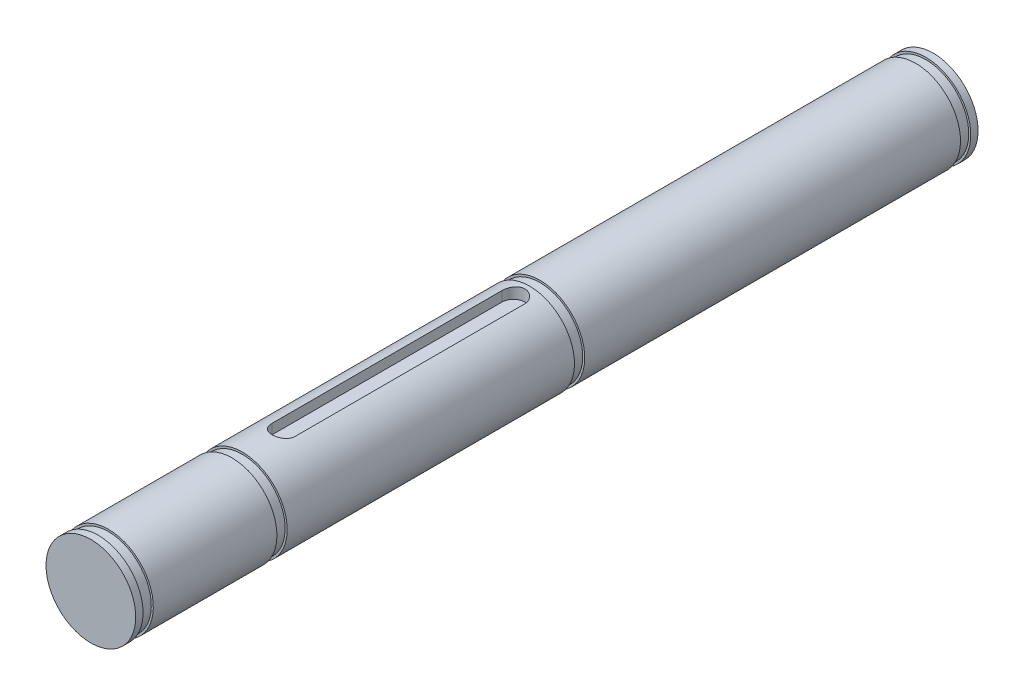
ISO-10303-21;
HEADER;
FILE_DESCRIPTION(('STEP AP214'),'2;1');
FILE_NAME('part.step','',(''),(''),'','','');
FILE_SCHEMA(('AUTOMOTIVE_DESIGN { 1 0 10303 214 1 1 1 1 }'));
ENDSEC;
DATA;
#1=APPLICATION_CONTEXT('core data for automotive mechanical design processes');
#2=APPLICATION_PROTOCOL_DEFINITION('international standard','automotive_design',2000,#1);
#3=PRODUCT_CONTEXT('',#1,'mechanical');
#4=PRODUCT('Part','Part','',(#3));
#5=PRODUCT_RELATED_PRODUCT_CATEGORY('part','',(#4));
#6=PRODUCT_DEFINITION_FORMATION('','',#4);
#7=PRODUCT_DEFINITION_CONTEXT('part definition',#1,'design');
#8=PRODUCT_DEFINITION('design','',#6,#7);
#9=PRODUCT_DEFINITION_SHAPE('','',#8);
#10=(LENGTH_UNIT() NAMED_UNIT(*) SI_UNIT(.MILLI.,.METRE.));
#11=(NAMED_UNIT(*) PLANE_ANGLE_UNIT() SI_UNIT($,.RADIAN.));
#12=(NAMED_UNIT(*) SI_UNIT($,.STERADIAN.) SOLID_ANGLE_UNIT());
#13=UNCERTAINTY_MEASURE_WITH_UNIT(LENGTH_MEASURE(1.E-05),#10,'distance_accuracy_value','');
#14=(GEOMETRIC_REPRESENTATION_CONTEXT(3) GLOBAL_UNCERTAINTY_ASSIGNED_CONTEXT((#13)) GLOBAL_UNIT_ASSIGNED_CONTEXT((#10,
#11,#12)) REPRESENTATION_CONTEXT('',''));
#15=CARTESIAN_POINT('',(0.,0.,0.));
#16=DIRECTION('',(0.,0.,1.));
#17=DIRECTION('',(1.,0.,0.));
#18=AXIS2_PLACEMENT_3D('',#15,#16,#17);
#19=CARTESIAN_POINT('',(0.,0.,0.));
#20=DIRECTION('',(0.,0.,-1.));
#21=DIRECTION('',(-1.,0.,0.));
#22=AXIS2_PLACEMENT_3D('',#19,#20,#21);
#23=CYLINDRICAL_SURFACE('',#22,6.223);
#24=CARTESIAN_POINT('',(0.,0.,0.));
#25=DIRECTION('',(0.,0.,-1.));
#26=DIRECTION('',(-1.,0.,0.));
#27=AXIS2_PLACEMENT_3D('',#24,#25,#26);
#28=CIRCLE('',#27,6.223);
#29=CARTESIAN_POINT('',(-6.223,0.,0.));
#30=VERTEX_POINT('',#29);
#31=EDGE_CURVE('E160',#30,#30,#28,.T.);
#32=ORIENTED_EDGE('',*,*,#31,.T.);
#33=EDGE_LOOP('',(#32));
#34=FACE_BOUND('',#33,.T.);
#35=CARTESIAN_POINT('',(0.,0.,-1.016));
#36=DIRECTION('',(0.,0.,-1.));
#37=DIRECTION('',(0.,1.,0.));
#38=AXIS2_PLACEMENT_3D('',#35,#36,#37);
#39=CIRCLE('',#38,6.223);
#40=CARTESIAN_POINT('',(0.,6.223,-1.016));
#41=VERTEX_POINT('',#40);
#42=EDGE_CURVE('E161',#41,#41,#39,.F.);
#43=ORIENTED_EDGE('',*,*,#42,.T.);
#44=EDGE_LOOP('',(#43));
#45=FACE_BOUND('',#44,.T.);
#46=ADVANCED_FACE('F43',(#34,#45),#23,.T.);
#47=CARTESIAN_POINT('',(0.,0.,0.));
#48=DIRECTION('',(0.,0.,1.));
#49=DIRECTION('',(1.,0.,0.));
#50=AXIS2_PLACEMENT_3D('',#47,#48,#49);
#51=PLANE('',#50);
#52=ORIENTED_EDGE('',*,*,#31,.F.);
#53=EDGE_LOOP('',(#52));
#54=FACE_BOUND('',#53,.T.);
#55=ADVANCED_FACE('F45',(#54),#51,.T.);
#56=CARTESIAN_POINT('',(0.,5.9436,-1.016));
#57=DIRECTION('',(0.,0.,-1.));
#58=DIRECTION('',(0.,1.,0.));
#59=AXIS2_PLACEMENT_3D('',#56,#57,#58);
#60=PLANE('',#59);
#61=ORIENTED_EDGE('',*,*,#42,.F.);
#62=EDGE_LOOP('',(#61));
#63=FACE_BOUND('',#62,.T.);
#64=CARTESIAN_POINT('',(0.,0.,-1.016));
#65=DIRECTION('',(0.,0.,-1.));
#66=DIRECTION('',(0.,1.,0.));
#67=AXIS2_PLACEMENT_3D('',#64,#65,#66);
#68=CIRCLE('',#67,5.9436);
#69=CARTESIAN_POINT('',(0.,5.9436,-1.016));
#70=VERTEX_POINT('',#69);
#71=EDGE_CURVE('E124',#70,#70,#68,.T.);
#72=ORIENTED_EDGE('',*,*,#71,.F.);
#73=EDGE_LOOP('',(#72));
#74=FACE_BOUND('',#73,.T.);
#75=ADVANCED_FACE('F269',(#63,#74),#60,.T.);
#76=CARTESIAN_POINT('',(0.,5.9436,-2.4384));
#77=DIRECTION('',(0.,0.,-1.));
#78=DIRECTION('',(0.,1.,0.));
#79=AXIS2_PLACEMENT_3D('',#76,#77,#78);
#80=PLANE('',#79);
#81=CARTESIAN_POINT('',(0.,0.,-2.4384));
#82=DIRECTION('',(0.,0.,-1.));
#83=DIRECTION('',(0.,1.,0.));
#84=AXIS2_PLACEMENT_3D('',#81,#82,#83);
#85=CIRCLE('',#84,6.223);
#86=CARTESIAN_POINT('',(0.,6.223,-2.4384));
#87=VERTEX_POINT('',#86);
#88=EDGE_CURVE('E189',#87,#87,#85,.F.);
#89=ORIENTED_EDGE('',*,*,#88,.T.);
#90=EDGE_LOOP('',(#89));
#91=FACE_BOUND('',#90,.T.);
#92=CARTESIAN_POINT('',(0.,0.,-2.4384));
#93=DIRECTION('',(0.,0.,-1.));
#94=DIRECTION('',(0.,1.,0.));
#95=AXIS2_PLACEMENT_3D('',#92,#93,#94);
#96=CIRCLE('',#95,5.9436);
#97=CARTESIAN_POINT('',(0.,5.9436,-2.4384));
#98=VERTEX_POINT('',#97);
#99=EDGE_CURVE('E128',#98,#98,#96,.T.);
#100=ORIENTED_EDGE('',*,*,#99,.T.);
#101=EDGE_LOOP('',(#100));
#102=FACE_BOUND('',#101,.T.);
#103=ADVANCED_FACE('F292',(#91,#102),#80,.F.);
#104=CARTESIAN_POINT('',(0.,0.,0.));
#105=DIRECTION('',(0.,0.,-1.));
#106=DIRECTION('',(0.,1.,0.));
#107=AXIS2_PLACEMENT_3D('',#104,#105,#106);
#108=CYLINDRICAL_SURFACE('',#107,5.9436);
#109=ORIENTED_EDGE('',*,*,#99,.F.);
#110=EDGE_LOOP('',(#109));
#111=FACE_BOUND('',#110,.T.);
#112=ORIENTED_EDGE('',*,*,#71,.T.);
#113=EDGE_LOOP('',(#112));
#114=FACE_BOUND('',#113,.T.);
#115=ADVANCED_FACE('F220',(#111,#114),#108,.T.);
#116=ORIENTED_EDGE('',*,*,#88,.F.);
#117=EDGE_LOOP('',(#116));
#118=FACE_BOUND('',#117,.T.);
#119=CARTESIAN_POINT('',(0.,0.,-19.5834));
#120=DIRECTION('',(0.,0.,-1.));
#121=DIRECTION('',(0.,1.,0.));
#122=AXIS2_PLACEMENT_3D('',#119,#120,#121);
#123=CIRCLE('',#122,6.223);
#124=CARTESIAN_POINT('',(0.,6.223,-19.5834));
#125=VERTEX_POINT('',#124);
#126=EDGE_CURVE('E169',#125,#125,#123,.F.);
#127=ORIENTED_EDGE('',*,*,#126,.T.);
#128=EDGE_LOOP('',(#127));
#129=FACE_BOUND('',#128,.T.);
#130=ADVANCED_FACE('F259',(#118,#129),#23,.T.);
#131=CARTESIAN_POINT('',(0.,5.9436,-19.5834));
#132=DIRECTION('',(0.,0.,-1.));
#133=DIRECTION('',(0.,1.,0.));
#134=AXIS2_PLACEMENT_3D('',#131,#132,#133);
#135=PLANE('',#134);
#136=ORIENTED_EDGE('',*,*,#126,.F.);
#137=EDGE_LOOP('',(#136));
#138=FACE_BOUND('',#137,.T.);
#139=CARTESIAN_POINT('',(0.,0.,-19.5834));
#140=DIRECTION('',(0.,0.,-1.));
#141=DIRECTION('',(0.,1.,0.));
#142=AXIS2_PLACEMENT_3D('',#139,#140,#141);
#143=CIRCLE('',#142,5.9436);
#144=CARTESIAN_POINT('',(0.,5.9436,-19.5834));
#145=VERTEX_POINT('',#144);
#146=EDGE_CURVE('E146',#145,#145,#143,.T.);
#147=ORIENTED_EDGE('',*,*,#146,.F.);
#148=EDGE_LOOP('',(#147));
#149=FACE_BOUND('',#148,.T.);
#150=ADVANCED_FACE('F283',(#138,#149),#135,.T.);
#151=CARTESIAN_POINT('',(0.,5.9436,-21.0058));
#152=DIRECTION('',(0.,0.,-1.));
#153=DIRECTION('',(0.,1.,0.));
#154=AXIS2_PLACEMENT_3D('',#151,#152,#153);
#155=PLANE('',#154);
#156=CARTESIAN_POINT('',(0.,0.,-21.0058));
#157=DIRECTION('',(0.,0.,-1.));
#158=DIRECTION('',(0.,1.,0.));
#159=AXIS2_PLACEMENT_3D('',#156,#157,#158);
#160=CIRCLE('',#159,6.223);
#161=CARTESIAN_POINT('',(0.,6.223,-21.0058));
#162=VERTEX_POINT('',#161);
#163=EDGE_CURVE('E133',#162,#162,#160,.F.);
#164=ORIENTED_EDGE('',*,*,#163,.T.);
#165=EDGE_LOOP('',(#164));
#166=FACE_BOUND('',#165,.T.);
#167=CARTESIAN_POINT('',(0.,0.,-21.0058));
#168=DIRECTION('',(0.,0.,-1.));
#169=DIRECTION('',(0.,1.,0.));
#170=AXIS2_PLACEMENT_3D('',#167,#168,#169);
#171=CIRCLE('',#170,5.9436);
#172=CARTESIAN_POINT('',(0.,5.9436,-21.0058));
#173=VERTEX_POINT('',#172);
#174=EDGE_CURVE('E117',#173,#173,#171,.T.);
#175=ORIENTED_EDGE('',*,*,#174,.T.);
#176=EDGE_LOOP('',(#175));
#177=FACE_BOUND('',#176,.T.);
#178=ADVANCED_FACE('F289',(#166,#177),#155,.F.);
#179=CARTESIAN_POINT('',(0.,0.,0.));
#180=DIRECTION('',(0.,0.,-1.));
#181=DIRECTION('',(0.,1.,0.));
#182=AXIS2_PLACEMENT_3D('',#179,#180,#181);
#183=CYLINDRICAL_SURFACE('',#182,5.9436);
#184=ORIENTED_EDGE('',*,*,#174,.F.);
#185=EDGE_LOOP('',(#184));
#186=FACE_BOUND('',#185,.T.);
#187=ORIENTED_EDGE('',*,*,#146,.T.);
#188=EDGE_LOOP('',(#187));
#189=FACE_BOUND('',#188,.T.);
#190=ADVANCED_FACE('F237',(#186,#189),#183,.T.);
#191=CARTESIAN_POINT('',(1.5875,6.01710667596977,-58.6105));
#192=CARTESIAN_POINT('',(1.5875005701701,6.01710364845781,-58.6543838559361));
#193=CARTESIAN_POINT('',(1.58567919296902,6.01758736569205,-58.698245934586));
#194=CARTESIAN_POINT('',(1.57841866111704,6.01949703107223,-58.7856414354814));
#195=CARTESIAN_POINT('',(1.57298013404162,6.02092281576919,-58.8291749134142));
#196=CARTESIAN_POINT('',(1.55131916197274,6.02655570446071,-58.9586260804381));
#197=CARTESIAN_POINT('',(1.52975096821002,6.03211870377822,-59.043653214695));
#198=CARTESIAN_POINT('',(1.47306141360106,6.04621039434029,-59.2087258604606));
#199=CARTESIAN_POINT('',(1.43794164745103,6.05473873662317,-59.2887719568319));
#200=CARTESIAN_POINT('',(1.35518953397575,6.07379514839304,-59.4418780696546));
#201=CARTESIAN_POINT('',(1.30755359796304,6.08432379117421,-59.5149360742435));
#202=CARTESIAN_POINT('',(1.19996859488497,6.10646163717685,-59.6536164108676));
#203=CARTESIAN_POINT('',(1.1397869868597,6.11808857604108,-59.7190554672265));
#204=CARTESIAN_POINT('',(1.00931412313929,6.14096034374597,-59.8390344795371));
#205=CARTESIAN_POINT('',(0.939021247363957,6.15220511099547,-59.8935726855448));
#206=CARTESIAN_POINT('',(0.789056046686835,6.17324278337169,-59.9909542008227));
#207=CARTESIAN_POINT('',(0.709262053994441,6.18301216443855,-60.0336156622201));
#208=CARTESIAN_POINT('',(0.543348080872327,6.19979381228296,-60.1048477653913));
#209=CARTESIAN_POINT('',(0.457229385336776,6.2068066372395,-60.133421260156));
#210=CARTESIAN_POINT('',(0.283030293016381,6.21715952316581,-60.1750767944438));
#211=CARTESIAN_POINT('',(0.195029302972404,6.22057376031613,-60.1884721492321));
#212=CARTESIAN_POINT('',(0.0179654008725225,6.22360356313391,-60.200375425507));
#213=CARTESIAN_POINT('',(-0.0710973698212901,6.22321962895926,-60.1988853071702));
#214=CARTESIAN_POINT('',(-0.245577328268625,6.218751155342,-60.1812832888146));
#215=CARTESIAN_POINT('',(-0.331031202569417,6.21475231769183,-60.1655099982174));
#216=CARTESIAN_POINT('',(-0.498035898847957,6.20360360177289,-60.1203346538793));
#217=CARTESIAN_POINT('',(-0.579586544001189,6.19645358089836,-60.0909319833423));
#218=CARTESIAN_POINT('',(-0.737355483050921,6.17967587694757,-60.0190625423046));
#219=CARTESIAN_POINT('',(-0.813516931427579,6.17002570112479,-59.9764764509113));
#220=CARTESIAN_POINT('',(-0.957728419355806,6.14929270179402,-59.8795406094037));
#221=CARTESIAN_POINT('',(-1.02577717459688,6.13820965202686,-59.8251890005295));
#222=CARTESIAN_POINT('',(-1.1538464146154,6.11544941756022,-59.7044625336326));
#223=CARTESIAN_POINT('',(-1.21358813277447,6.1037642876235,-59.6377931626802));
#224=CARTESIAN_POINT('',(-1.32112100786564,6.08139740926303,-59.4952409823488));
#225=CARTESIAN_POINT('',(-1.36890888586843,6.07071593664229,-59.4193556535002));
#226=CARTESIAN_POINT('',(-1.45136992703091,6.05153400133908,-59.259949090009));
#227=CARTESIAN_POINT('',(-1.4859659958378,6.04304645028231,-59.1763864060228));
#228=CARTESIAN_POINT('',(-1.54048655383295,6.02938085007214,-59.0044104649481));
#229=CARTESIAN_POINT('',(-1.56043300375462,6.02419784872824,-58.9160046826629));
#230=CARTESIAN_POINT('',(-1.57764773242627,6.019698856486,-58.790772657454));
#231=CARTESIAN_POINT('',(-1.58134288301185,6.01872834590968,-58.7547945790882));
#232=CARTESIAN_POINT('',(-1.58626628840802,6.01743251129064,-58.6827167376414));
#233=CARTESIAN_POINT('',(-1.58749850987853,6.01710614982697,-58.6466172641706));
#234=CARTESIAN_POINT('',(-1.5875,6.01710667596977,-58.6105));
#235=B_SPLINE_CURVE_WITH_KNOTS('',3,(#191,#192,#193,#194,#195,#196,#197,#198,#199,#200,#201,
#202,#203,#204,#205,#206,#207,#208,#209,#210,#211,#212,#213,#214,#215,#216,#217,#218,#219,#220,
#221,#222,#223,#224,#225,#226,#227,#228,#229,#230,#231,#232,#233,#234),.UNSPECIFIED.,.F.,.F.,(4,
2,2,2,2,2,2,2,2,2,2,2,2,2,2,2,2,2,2,2,2,4),(0.,0.131568299053689,0.26311377696094,
0.525438742200572,0.787732847470651,1.05010224100555,1.31785377248123,1.58564825239251,
1.85734198979802,2.12898068317312,2.39490364205535,2.66079158363921,2.92053658849681,
3.18029334923529,3.44247348094867,3.7046950631172,3.97427268453386,4.24392417000194,
4.51512821871098,4.78592488040758,4.89439368330592,5.00268765102122),.UNSPECIFIED.);
#236=CARTESIAN_POINT('',(1.5875,6.01710667596977,-58.6105));
#237=VERTEX_POINT('',#236);
#238=CARTESIAN_POINT('',(-1.5875,6.01710667596977,-58.6105));
#239=VERTEX_POINT('',#238);
#240=EDGE_CURVE('E165',#237,#239,#235,.T.);
#241=ORIENTED_EDGE('',*,*,#240,.F.);
#242=DIRECTION('',(0.,0.,-1.));
#243=VECTOR('',#242,1.);
#244=CARTESIAN_POINT('',(1.5875,6.01710667596977,0.));
#245=LINE('',#244,#243);
#246=CARTESIAN_POINT('',(1.5875,6.01710667596977,-26.7335));
#247=VERTEX_POINT('',#246);
#248=EDGE_CURVE('E11',#247,#237,#245,.T.);
#249=ORIENTED_EDGE('',*,*,#248,.F.);
#250=CARTESIAN_POINT('',(-1.5875,6.01710667596977,-26.7335));
#251=CARTESIAN_POINT('',(-1.5875005701701,6.01710364845781,-26.6896161440639));
#252=CARTESIAN_POINT('',(-1.58567919296902,6.01758736569206,-26.645754065414));
#253=CARTESIAN_POINT('',(-1.57841866111703,6.01949703107223,-26.5583585645186));
#254=CARTESIAN_POINT('',(-1.57298013404161,6.02092281576919,-26.5148250865857));
#255=CARTESIAN_POINT('',(-1.55131916197274,6.02655570446071,-26.3853739195619));
#256=CARTESIAN_POINT('',(-1.52975096821001,6.03211870377822,-26.300346785305));
#257=CARTESIAN_POINT('',(-1.47306141360106,6.04621039434029,-26.1352741395394));
#258=CARTESIAN_POINT('',(-1.43794164745103,6.05473873662317,-26.0552280431681));
#259=CARTESIAN_POINT('',(-1.35518953397575,6.07379514839304,-25.9021219303454));
#260=CARTESIAN_POINT('',(-1.30755359796304,6.08432379117421,-25.8290639257565));
#261=CARTESIAN_POINT('',(-1.19996859488497,6.10646163717685,-25.6903835891324));
#262=CARTESIAN_POINT('',(-1.1397869868597,6.11808857604108,-25.6249445327734));
#263=CARTESIAN_POINT('',(-1.00931412313929,6.14096034374597,-25.5049655204629));
#264=CARTESIAN_POINT('',(-0.939021247363956,6.15220511099547,-25.4504273144552));
#265=CARTESIAN_POINT('',(-0.789056046686833,6.17324278337169,-25.3530457991772));
#266=CARTESIAN_POINT('',(-0.709262053994439,6.18301216443855,-25.3103843377798));
#267=CARTESIAN_POINT('',(-0.543348080872324,6.19979381228296,-25.2391522346087));
#268=CARTESIAN_POINT('',(-0.457229385336775,6.2068066372395,-25.210578739844));
#269=CARTESIAN_POINT('',(-0.283030293016381,6.21715952316581,-25.1689232055562));
#270=CARTESIAN_POINT('',(-0.195029302972405,6.22057376031613,-25.1555278507679));
#271=CARTESIAN_POINT('',(-0.0179654008725233,6.22360356313391,-25.1436245744929));
#272=CARTESIAN_POINT('',(0.0710973698212896,6.22321962895926,-25.1451146928298));
#273=CARTESIAN_POINT('',(0.245577328268624,6.218751155342,-25.1627167111854));
#274=CARTESIAN_POINT('',(0.331031202569416,6.21475231769183,-25.1784900017826));
#275=CARTESIAN_POINT('',(0.498035898847957,6.20360360177289,-25.2236653461207));
#276=CARTESIAN_POINT('',(0.57958654400119,6.19645358089836,-25.2530680166577));
#277=CARTESIAN_POINT('',(0.737355483050923,6.17967587694757,-25.3249374576954));
#278=CARTESIAN_POINT('',(0.81351693142758,6.17002570112479,-25.3675235490887));
#279=CARTESIAN_POINT('',(0.957728419355807,6.14929270179402,-25.4644593905962));
#280=CARTESIAN_POINT('',(1.02577717459688,6.13820965202686,-25.5188109994705));
#281=CARTESIAN_POINT('',(1.1538464146154,6.11544941756022,-25.6395374663674));
#282=CARTESIAN_POINT('',(1.21358813277448,6.1037642876235,-25.7062068373198));
#283=CARTESIAN_POINT('',(1.32112100786564,6.08139740926303,-25.8487590176512));
#284=CARTESIAN_POINT('',(1.36890888586843,6.07071593664228,-25.9246443464997));
#285=CARTESIAN_POINT('',(1.45136992703091,6.05153400133908,-26.084050909991));
#286=CARTESIAN_POINT('',(1.4859659958378,6.04304645028231,-26.1676135939772));
#287=CARTESIAN_POINT('',(1.54048655383295,6.02938085007214,-26.3395895350518));
#288=CARTESIAN_POINT('',(1.56043300375462,6.02419784872824,-26.4279953173371));
#289=CARTESIAN_POINT('',(1.57764773242627,6.019698856486,-26.553227342546));
#290=CARTESIAN_POINT('',(1.58134288301185,6.01872834590968,-26.5892054209118));
#291=CARTESIAN_POINT('',(1.58626628840802,6.01743251129064,-26.6612832623586));
#292=CARTESIAN_POINT('',(1.58749850987853,6.01710614982697,-26.6973827358294));
#293=CARTESIAN_POINT('',(1.5875,6.01710667596977,-26.7335));
#294=B_SPLINE_CURVE_WITH_KNOTS('',3,(#250,#251,#252,#253,#254,#255,#256,#257,#258,#259,#260,
#261,#262,#263,#264,#265,#266,#267,#268,#269,#270,#271,#272,#273,#274,#275,#276,#277,#278,#279,
#280,#281,#282,#283,#284,#285,#286,#287,#288,#289,#290,#291,#292,#293),.UNSPECIFIED.,.F.,.F.,(4,
2,2,2,2,2,2,2,2,2,2,2,2,2,2,2,2,2,2,2,2,4),(0.,0.131568299053696,0.263113776960947,
0.525438742200575,0.787732847470659,1.05010224100556,1.31785377248123,1.58564825239251,
1.85734198979803,2.12898068317312,2.39490364205535,2.66079158363921,2.92053658849681,
3.18029334923529,3.44247348094867,3.70469506311721,3.97427268453387,4.24392417000194,
4.51512821871099,4.78592488040759,4.89439368330592,5.00268765102122),.UNSPECIFIED.);
#295=CARTESIAN_POINT('',(-1.5875,6.01710667596977,-26.7335));
#296=VERTEX_POINT('',#295);
#297=EDGE_CURVE('E52',#296,#247,#294,.T.);
#298=ORIENTED_EDGE('',*,*,#297,.F.);
#299=DIRECTION('',(0.,0.,-1.));
#300=VECTOR('',#299,1.);
#301=CARTESIAN_POINT('',(-1.5875,6.01710667596977,0.));
#302=LINE('',#301,#300);
#303=EDGE_CURVE('E203',#239,#296,#302,.F.);
#304=ORIENTED_EDGE('',*,*,#303,.F.);
#305=EDGE_LOOP('',(#241,#249,#298,#304));
#306=FACE_BOUND('',#305,.T.);
#307=ORIENTED_EDGE('',*,*,#163,.F.);
#308=EDGE_LOOP('',(#307));
#309=FACE_BOUND('',#308,.T.);
#310=CARTESIAN_POINT('',(0.,0.,-60.8584));
#311=DIRECTION('',(0.,0.,-1.));
#312=DIRECTION('',(0.,1.,0.));
#313=AXIS2_PLACEMENT_3D('',#310,#311,#312);
#314=CIRCLE('',#313,6.223);
#315=CARTESIAN_POINT('',(0.,6.223,-60.8584));
#316=VERTEX_POINT('',#315);
#317=EDGE_CURVE('E185',#316,#316,#314,.F.);
#318=ORIENTED_EDGE('',*,*,#317,.T.);
#319=EDGE_LOOP('',(#318));
#320=FACE_BOUND('',#319,.T.);
#321=ADVANCED_FACE('F233',(#306,#309,#320),#23,.T.);
#322=CARTESIAN_POINT('',(0.,5.9436,-60.8584));
#323=DIRECTION('',(0.,0.,-1.));
#324=DIRECTION('',(0.,1.,0.));
#325=AXIS2_PLACEMENT_3D('',#322,#323,#324);
#326=PLANE('',#325);
#327=ORIENTED_EDGE('',*,*,#317,.F.);
#328=EDGE_LOOP('',(#327));
#329=FACE_BOUND('',#328,.T.);
#330=CARTESIAN_POINT('',(0.,0.,-60.8584));
#331=DIRECTION('',(0.,0.,-1.));
#332=DIRECTION('',(0.,1.,0.));
#333=AXIS2_PLACEMENT_3D('',#330,#331,#332);
#334=CIRCLE('',#333,5.94359999999999);
#335=CARTESIAN_POINT('',(0.,5.9436,-60.8584));
#336=VERTEX_POINT('',#335);
#337=EDGE_CURVE('E129',#336,#336,#334,.T.);
#338=ORIENTED_EDGE('',*,*,#337,.F.);
#339=EDGE_LOOP('',(#338));
#340=FACE_BOUND('',#339,.T.);
#341=ADVANCED_FACE('F236',(#329,#340),#326,.T.);
#342=CARTESIAN_POINT('',(0.,5.9436,-62.2808));
#343=DIRECTION('',(0.,0.,-1.));
#344=DIRECTION('',(0.,1.,0.));
#345=AXIS2_PLACEMENT_3D('',#342,#343,#344);
#346=PLANE('',#345);
#347=CARTESIAN_POINT('',(0.,0.,-62.2808));
#348=DIRECTION('',(0.,0.,-1.));
#349=DIRECTION('',(0.,1.,0.));
#350=AXIS2_PLACEMENT_3D('',#347,#348,#349);
#351=CIRCLE('',#350,6.223);
#352=CARTESIAN_POINT('',(0.,6.223,-62.2808));
#353=VERTEX_POINT('',#352);
#354=EDGE_CURVE('E181',#353,#353,#351,.F.);
#355=ORIENTED_EDGE('',*,*,#354,.T.);
#356=EDGE_LOOP('',(#355));
#357=FACE_BOUND('',#356,.T.);
#358=CARTESIAN_POINT('',(0.,0.,-62.2808));
#359=DIRECTION('',(0.,0.,-1.));
#360=DIRECTION('',(0.,1.,0.));
#361=AXIS2_PLACEMENT_3D('',#358,#359,#360);
#362=CIRCLE('',#361,5.94359999999999);
#363=CARTESIAN_POINT('',(0.,5.9436,-62.2808));
#364=VERTEX_POINT('',#363);
#365=EDGE_CURVE('E134',#364,#364,#362,.T.);
#366=ORIENTED_EDGE('',*,*,#365,.T.);
#367=EDGE_LOOP('',(#366));
#368=FACE_BOUND('',#367,.T.);
#369=ADVANCED_FACE('F245',(#357,#368),#346,.F.);
#370=CARTESIAN_POINT('',(0.,0.,0.));
#371=DIRECTION('',(0.,0.,-1.));
#372=DIRECTION('',(0.,1.,0.));
#373=AXIS2_PLACEMENT_3D('',#370,#371,#372);
#374=CYLINDRICAL_SURFACE('',#373,5.94359999999999);
#375=ORIENTED_EDGE('',*,*,#365,.F.);
#376=EDGE_LOOP('',(#375));
#377=FACE_BOUND('',#376,.T.);
#378=ORIENTED_EDGE('',*,*,#337,.T.);
#379=EDGE_LOOP('',(#378));
#380=FACE_BOUND('',#379,.T.);
#381=ADVANCED_FACE('F249',(#377,#380),#374,.T.);
#382=ORIENTED_EDGE('',*,*,#354,.F.);
#383=EDGE_LOOP('',(#382));
#384=FACE_BOUND('',#383,.T.);
#385=CARTESIAN_POINT('',(0.,0.,-114.4016));
#386=DIRECTION('',(0.,0.,-1.));
#387=DIRECTION('',(0.,1.,0.));
#388=AXIS2_PLACEMENT_3D('',#385,#386,#387);
#389=CIRCLE('',#388,6.223);
#390=CARTESIAN_POINT('',(0.,6.223,-114.4016));
#391=VERTEX_POINT('',#390);
#392=EDGE_CURVE('E177',#391,#391,#389,.F.);
#393=ORIENTED_EDGE('',*,*,#392,.T.);
#394=EDGE_LOOP('',(#393));
#395=FACE_BOUND('',#394,.T.);
#396=ADVANCED_FACE('F238',(#384,#395),#23,.T.);
#397=CARTESIAN_POINT('',(0.,5.9436,-114.4016));
#398=DIRECTION('',(0.,0.,-1.));
#399=DIRECTION('',(0.,1.,0.));
#400=AXIS2_PLACEMENT_3D('',#397,#398,#399);
#401=PLANE('',#400);
#402=ORIENTED_EDGE('',*,*,#392,.F.);
#403=EDGE_LOOP('',(#402));
#404=FACE_BOUND('',#403,.T.);
#405=CARTESIAN_POINT('',(0.,0.,-114.4016));
#406=DIRECTION('',(0.,0.,-1.));
#407=DIRECTION('',(0.,1.,0.));
#408=AXIS2_PLACEMENT_3D('',#405,#406,#407);
#409=CIRCLE('',#408,5.94359999999999);
#410=CARTESIAN_POINT('',(0.,5.9436,-114.4016));
#411=VERTEX_POINT('',#410);
#412=EDGE_CURVE('E138',#411,#411,#409,.T.);
#413=ORIENTED_EDGE('',*,*,#412,.F.);
#414=EDGE_LOOP('',(#413));
#415=FACE_BOUND('',#414,.T.);
#416=ADVANCED_FACE('F257',(#404,#415),#401,.T.);
#417=CARTESIAN_POINT('',(0.,5.9436,-115.824));
#418=DIRECTION('',(0.,0.,-1.));
#419=DIRECTION('',(0.,1.,0.));
#420=AXIS2_PLACEMENT_3D('',#417,#418,#419);
#421=PLANE('',#420);
#422=CARTESIAN_POINT('',(0.,0.,-115.824));
#423=DIRECTION('',(0.,0.,-1.));
#424=DIRECTION('',(0.,1.,0.));
#425=AXIS2_PLACEMENT_3D('',#422,#423,#424);
#426=CIRCLE('',#425,6.223);
#427=CARTESIAN_POINT('',(0.,6.223,-115.824));
#428=VERTEX_POINT('',#427);
#429=EDGE_CURVE('E173',#428,#428,#426,.F.);
#430=ORIENTED_EDGE('',*,*,#429,.T.);
#431=EDGE_LOOP('',(#430));
#432=FACE_BOUND('',#431,.T.);
#433=CARTESIAN_POINT('',(0.,0.,-115.824));
#434=DIRECTION('',(0.,0.,-1.));
#435=DIRECTION('',(0.,1.,0.));
#436=AXIS2_PLACEMENT_3D('',#433,#434,#435);
#437=CIRCLE('',#436,5.94359999999999);
#438=CARTESIAN_POINT('',(0.,5.9436,-115.824));
#439=VERTEX_POINT('',#438);
#440=EDGE_CURVE('E142',#439,#439,#437,.T.);
#441=ORIENTED_EDGE('',*,*,#440,.T.);
#442=EDGE_LOOP('',(#441));
#443=FACE_BOUND('',#442,.T.);
#444=ADVANCED_FACE('F312',(#432,#443),#421,.F.);
#445=CARTESIAN_POINT('',(0.,0.,0.));
#446=DIRECTION('',(0.,0.,-1.));
#447=DIRECTION('',(0.,1.,0.));
#448=AXIS2_PLACEMENT_3D('',#445,#446,#447);
#449=CYLINDRICAL_SURFACE('',#448,5.94359999999999);
#450=ORIENTED_EDGE('',*,*,#440,.F.);
#451=EDGE_LOOP('',(#450));
#452=FACE_BOUND('',#451,.T.);
#453=ORIENTED_EDGE('',*,*,#412,.T.);
#454=EDGE_LOOP('',(#453));
#455=FACE_BOUND('',#454,.T.);
#456=ADVANCED_FACE('F278',(#452,#455),#449,.T.);
#457=CARTESIAN_POINT('',(0.,0.,-116.84));
#458=DIRECTION('',(0.,0.,-1.));
#459=DIRECTION('',(-1.,0.,0.));
#460=AXIS2_PLACEMENT_3D('',#457,#458,#459);
#461=PLANE('',#460);
#462=CARTESIAN_POINT('',(0.,0.,-116.84));
#463=DIRECTION('',(0.,0.,-1.));
#464=DIRECTION('',(-1.,0.,0.));
#465=AXIS2_PLACEMENT_3D('',#462,#463,#464);
#466=CIRCLE('',#465,6.223);
#467=CARTESIAN_POINT('',(-6.223,0.,-116.84));
#468=VERTEX_POINT('',#467);
#469=EDGE_CURVE('E156',#468,#468,#466,.T.);
#470=ORIENTED_EDGE('',*,*,#469,.T.);
#471=EDGE_LOOP('',(#470));
#472=FACE_BOUND('',#471,.T.);
#473=ADVANCED_FACE('F273',(#472),#461,.T.);
#474=ORIENTED_EDGE('',*,*,#429,.F.);
#475=EDGE_LOOP('',(#474));
#476=FACE_BOUND('',#475,.T.);
#477=ORIENTED_EDGE('',*,*,#469,.F.);
#478=EDGE_LOOP('',(#477));
#479=FACE_BOUND('',#478,.T.);
#480=ADVANCED_FACE('F204',(#476,#479),#23,.T.);
#481=CARTESIAN_POINT('',(0.,4.6355,-26.7335));
#482=DIRECTION('',(0.,1.,0.));
#483=DIRECTION('',(0.,0.,1.));
#484=AXIS2_PLACEMENT_3D('',#481,#482,#483);
#485=CYLINDRICAL_SURFACE('',#484,1.5875);
#486=DIRECTION('',(0.,1.,0.));
#487=VECTOR('',#486,1.);
#488=CARTESIAN_POINT('',(-1.5875,4.6355,-26.7335));
#489=LINE('',#488,#487);
#490=CARTESIAN_POINT('',(-1.5875,4.6355,-26.7335));
#491=VERTEX_POINT('',#490);
#492=EDGE_CURVE('E114',#491,#296,#489,.T.);
#493=ORIENTED_EDGE('',*,*,#492,.T.);
#494=ORIENTED_EDGE('',*,*,#297,.T.);
#495=DIRECTION('',(0.,1.,0.));
#496=VECTOR('',#495,1.);
#497=CARTESIAN_POINT('',(1.5875,4.6355,-26.7335));
#498=LINE('',#497,#496);
#499=CARTESIAN_POINT('',(1.5875,4.6355,-26.7335));
#500=VERTEX_POINT('',#499);
#501=EDGE_CURVE('E58',#500,#247,#498,.T.);
#502=ORIENTED_EDGE('',*,*,#501,.F.);
#503=CARTESIAN_POINT('',(0.,4.6355,-26.7335));
#504=DIRECTION('',(0.,1.,0.));
#505=DIRECTION('',(0.,0.,1.));
#506=AXIS2_PLACEMENT_3D('',#503,#504,#505);
#507=CIRCLE('',#506,1.5875);
#508=EDGE_CURVE('E87',#491,#500,#507,.T.);
#509=ORIENTED_EDGE('',*,*,#508,.F.);
#510=EDGE_LOOP('',(#493,#494,#502,#509));
#511=FACE_BOUND('',#510,.T.);
#512=ADVANCED_FACE('F85',(#511),#485,.F.);
#513=CARTESIAN_POINT('',(-1.5875,4.6355,-26.7335));
#514=DIRECTION('',(-1.,0.,0.));
#515=DIRECTION('',(0.,0.,1.));
#516=AXIS2_PLACEMENT_3D('',#513,#514,#515);
#517=PLANE('',#516);
#518=ORIENTED_EDGE('',*,*,#303,.T.);
#519=ORIENTED_EDGE('',*,*,#492,.F.);
#520=DIRECTION('',(0.,0.,1.));
#521=VECTOR('',#520,1.);
#522=CARTESIAN_POINT('',(-1.5875,4.6355,-26.7335));
#523=LINE('',#522,#521);
#524=CARTESIAN_POINT('',(-1.5875,4.6355,-58.6105));
#525=VERTEX_POINT('',#524);
#526=EDGE_CURVE('E91',#525,#491,#523,.T.);
#527=ORIENTED_EDGE('',*,*,#526,.F.);
#528=DIRECTION('',(0.,1.,0.));
#529=VECTOR('',#528,1.);
#530=CARTESIAN_POINT('',(-1.5875,4.6355,-58.6105));
#531=LINE('',#530,#529);
#532=EDGE_CURVE('E118',#525,#239,#531,.T.);
#533=ORIENTED_EDGE('',*,*,#532,.T.);
#534=EDGE_LOOP('',(#518,#519,#527,#533));
#535=FACE_BOUND('',#534,.T.);
#536=ADVANCED_FACE('F212',(#535),#517,.F.);
#537=CARTESIAN_POINT('',(0.,4.6355,-58.6105));
#538=DIRECTION('',(0.,1.,0.));
#539=DIRECTION('',(0.,0.,1.));
#540=AXIS2_PLACEMENT_3D('',#537,#538,#539);
#541=CYLINDRICAL_SURFACE('',#540,1.5875);
#542=DIRECTION('',(0.,1.,0.));
#543=VECTOR('',#542,1.);
#544=CARTESIAN_POINT('',(1.5875,4.6355,-58.6105));
#545=LINE('',#544,#543);
#546=CARTESIAN_POINT('',(1.5875,4.6355,-58.6105));
#547=VERTEX_POINT('',#546);
#548=EDGE_CURVE('E90',#547,#237,#545,.T.);
#549=ORIENTED_EDGE('',*,*,#548,.T.);
#550=ORIENTED_EDGE('',*,*,#240,.T.);
#551=ORIENTED_EDGE('',*,*,#532,.F.);
#552=CARTESIAN_POINT('',(0.,4.6355,-58.6105));
#553=DIRECTION('',(0.,1.,0.));
#554=DIRECTION('',(0.,0.,1.));
#555=AXIS2_PLACEMENT_3D('',#552,#553,#554);
#556=CIRCLE('',#555,1.5875);
#557=EDGE_CURVE('E101',#547,#525,#556,.T.);
#558=ORIENTED_EDGE('',*,*,#557,.F.);
#559=EDGE_LOOP('',(#549,#550,#551,#558));
#560=FACE_BOUND('',#559,.T.);
#561=ADVANCED_FACE('F207',(#560),#541,.F.);
#562=CARTESIAN_POINT('',(1.5875,4.6355,-26.7335));
#563=DIRECTION('',(1.,0.,0.));
#564=DIRECTION('',(0.,0.,-1.));
#565=AXIS2_PLACEMENT_3D('',#562,#563,#564);
#566=PLANE('',#565);
#567=ORIENTED_EDGE('',*,*,#248,.T.);
#568=ORIENTED_EDGE('',*,*,#548,.F.);
#569=DIRECTION('',(0.,0.,-1.));
#570=VECTOR('',#569,1.);
#571=CARTESIAN_POINT('',(1.5875,4.6355,-26.7335));
#572=LINE('',#571,#570);
#573=EDGE_CURVE('E94',#500,#547,#572,.T.);
#574=ORIENTED_EDGE('',*,*,#573,.F.);
#575=ORIENTED_EDGE('',*,*,#501,.T.);
#576=EDGE_LOOP('',(#567,#568,#574,#575));
#577=FACE_BOUND('',#576,.T.);
#578=ADVANCED_FACE('F95',(#577),#566,.F.);
#579=CARTESIAN_POINT('',(0.,4.6355,-26.7335));
#580=DIRECTION('',(0.,1.,0.));
#581=DIRECTION('',(0.,0.,1.));
#582=AXIS2_PLACEMENT_3D('',#579,#580,#581);
#583=PLANE('',#582);
#584=ORIENTED_EDGE('',*,*,#508,.T.);
#585=ORIENTED_EDGE('',*,*,#573,.T.);
#586=ORIENTED_EDGE('',*,*,#557,.T.);
#587=ORIENTED_EDGE('',*,*,#526,.T.);
#588=EDGE_LOOP('',(#584,#585,#586,#587));
#589=FACE_BOUND('',#588,.T.);
#590=ADVANCED_FACE('F103',(#589),#583,.T.);
#591=CLOSED_SHELL('',(#46,#55,#75,#103,#115,#130,#150,#178,#190,#321,#341,#369,#381,#396,#416,
#444,#456,#473,#480,#512,#536,#561,#578,#590));
#592=MANIFOLD_SOLID_BREP('B2',#591);
#593=ADVANCED_BREP_SHAPE_REPRESENTATION('',(#18,#592),#14);
#594=SHAPE_DEFINITION_REPRESENTATION(#9,#593);
ENDSEC;
END-ISO-10303-21;
